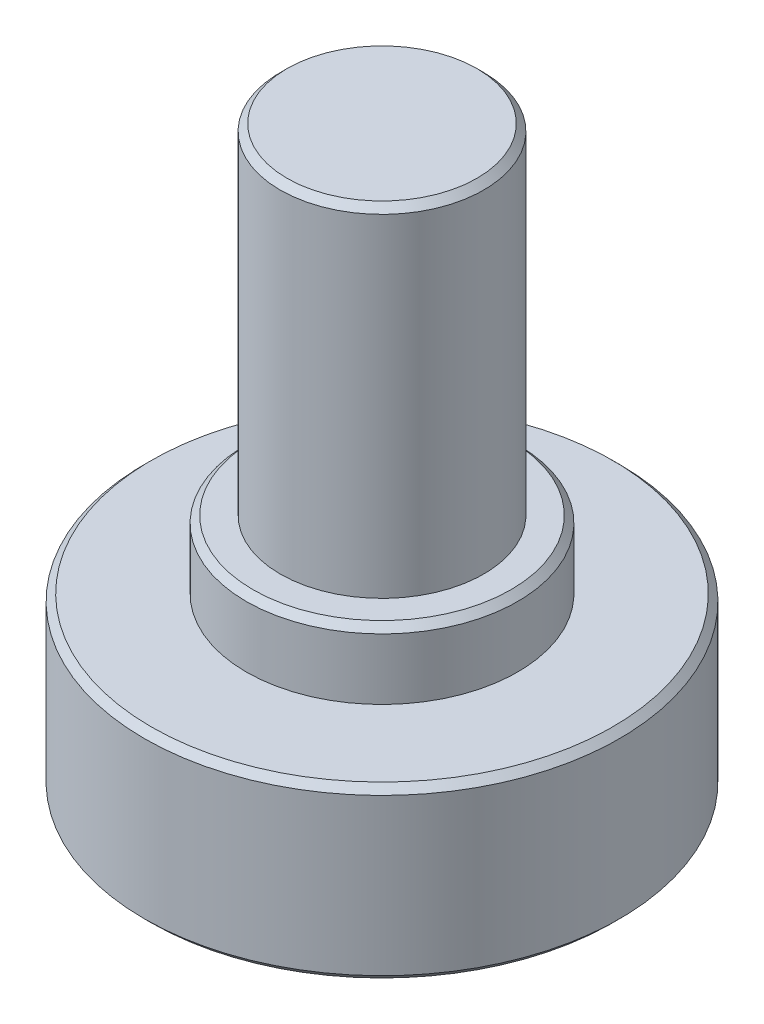
ISO-10303-21;
HEADER;
FILE_DESCRIPTION(('STEP AP214'),'2;1');
FILE_NAME('part.step','',(''),(''),'','','');
FILE_SCHEMA(('AUTOMOTIVE_DESIGN { 1 0 10303 214 1 1 1 1 }'));
ENDSEC;
DATA;
#1=APPLICATION_CONTEXT('core data for automotive mechanical design processes');
#2=APPLICATION_PROTOCOL_DEFINITION('international standard','automotive_design',2000,#1);
#3=PRODUCT_CONTEXT('',#1,'mechanical');
#4=PRODUCT('Part','Part','',(#3));
#5=PRODUCT_RELATED_PRODUCT_CATEGORY('part','',(#4));
#6=PRODUCT_DEFINITION_FORMATION('','',#4);
#7=PRODUCT_DEFINITION_CONTEXT('part definition',#1,'design');
#8=PRODUCT_DEFINITION('design','',#6,#7);
#9=PRODUCT_DEFINITION_SHAPE('','',#8);
#10=(LENGTH_UNIT() NAMED_UNIT(*) SI_UNIT(.MILLI.,.METRE.));
#11=(NAMED_UNIT(*) PLANE_ANGLE_UNIT() SI_UNIT($,.RADIAN.));
#12=(NAMED_UNIT(*) SI_UNIT($,.STERADIAN.) SOLID_ANGLE_UNIT());
#13=UNCERTAINTY_MEASURE_WITH_UNIT(LENGTH_MEASURE(1.E-05),#10,'distance_accuracy_value','');
#14=(GEOMETRIC_REPRESENTATION_CONTEXT(3) GLOBAL_UNCERTAINTY_ASSIGNED_CONTEXT((#13)) GLOBAL_UNIT_ASSIGNED_CONTEXT((#10,
#11,#12)) REPRESENTATION_CONTEXT('',''));
#15=CARTESIAN_POINT('',(0.,0.,0.));
#16=DIRECTION('',(0.,0.,1.));
#17=DIRECTION('',(1.,0.,0.));
#18=AXIS2_PLACEMENT_3D('',#15,#16,#17);
#19=CARTESIAN_POINT('',(0.,5.,0.));
#20=DIRECTION('',(0.,-1.,0.));
#21=DIRECTION('',(0.,0.,-1.));
#22=AXIS2_PLACEMENT_3D('',#19,#20,#21);
#23=CYLINDRICAL_SURFACE('',#22,7.);
#24=CARTESIAN_POINT('',(0.,0.200000000000001,0.));
#25=DIRECTION('',(0.,1.,0.));
#26=DIRECTION('',(0.,0.,1.));
#27=AXIS2_PLACEMENT_3D('',#24,#25,#26);
#28=CIRCLE('',#27,7.);
#29=CARTESIAN_POINT('',(0.,0.200000000000001,7.));
#30=VERTEX_POINT('',#29);
#31=EDGE_CURVE('E172',#30,#30,#28,.T.);
#32=ORIENTED_EDGE('',*,*,#31,.T.);
#33=EDGE_LOOP('',(#32));
#34=FACE_BOUND('',#33,.T.);
#35=CARTESIAN_POINT('',(0.,4.79999999999999,0.));
#36=DIRECTION('',(0.,1.,0.));
#37=DIRECTION('',(0.,0.,1.));
#38=AXIS2_PLACEMENT_3D('',#35,#36,#37);
#39=CIRCLE('',#38,7.);
#40=CARTESIAN_POINT('',(0.,4.79999999999999,7.));
#41=VERTEX_POINT('',#40);
#42=EDGE_CURVE('E169',#41,#41,#39,.F.);
#43=ORIENTED_EDGE('',*,*,#42,.T.);
#44=EDGE_LOOP('',(#43));
#45=FACE_BOUND('',#44,.T.);
#46=ADVANCED_FACE('F43',(#34,#45),#23,.T.);
#47=CARTESIAN_POINT('',(0.,5.,0.));
#48=DIRECTION('',(0.,1.,0.));
#49=DIRECTION('',(0.,0.,1.));
#50=AXIS2_PLACEMENT_3D('',#47,#48,#49);
#51=PLANE('',#50);
#52=CARTESIAN_POINT('',(0.,5.,0.));
#53=DIRECTION('',(0.,1.,0.));
#54=DIRECTION('',(0.,0.,1.));
#55=AXIS2_PLACEMENT_3D('',#52,#53,#54);
#56=CIRCLE('',#55,6.79999999999999);
#57=CARTESIAN_POINT('',(0.,5.,6.79999999999999));
#58=VERTEX_POINT('',#57);
#59=EDGE_CURVE('E11',#58,#58,#56,.T.);
#60=ORIENTED_EDGE('',*,*,#59,.T.);
#61=EDGE_LOOP('',(#60));
#62=FACE_BOUND('',#61,.T.);
#63=CARTESIAN_POINT('',(0.,5.,0.));
#64=DIRECTION('',(0.,1.,0.));
#65=DIRECTION('',(0.,0.,1.));
#66=AXIS2_PLACEMENT_3D('',#63,#64,#65);
#67=CIRCLE('',#66,4.);
#68=CARTESIAN_POINT('',(0.,5.,4.));
#69=VERTEX_POINT('',#68);
#70=EDGE_CURVE('E146',#69,#69,#67,.T.);
#71=ORIENTED_EDGE('',*,*,#70,.F.);
#72=EDGE_LOOP('',(#71));
#73=FACE_BOUND('',#72,.T.);
#74=ADVANCED_FACE('F187',(#62,#73),#51,.T.);
#75=CARTESIAN_POINT('',(0.,0.,0.));
#76=DIRECTION('',(0.,1.,0.));
#77=DIRECTION('',(0.,0.,1.));
#78=AXIS2_PLACEMENT_3D('',#75,#76,#77);
#79=PLANE('',#78);
#80=DIRECTION('',(-0.5,0.,0.866025403784438));
#81=VECTOR('',#80,1.);
#82=CARTESIAN_POINT('',(2.88675134594813,0.,0.));
#83=LINE('',#82,#81);
#84=CARTESIAN_POINT('',(2.88675134594813,0.,0.));
#85=VERTEX_POINT('',#84);
#86=CARTESIAN_POINT('',(1.44337567297406,0.,2.5));
#87=VERTEX_POINT('',#86);
#88=EDGE_CURVE('E133',#85,#87,#83,.T.);
#89=ORIENTED_EDGE('',*,*,#88,.F.);
#90=DIRECTION('',(0.5,0.,0.866025403784439));
#91=VECTOR('',#90,1.);
#92=CARTESIAN_POINT('',(1.44337567297407,0.,-2.5));
#93=LINE('',#92,#91);
#94=CARTESIAN_POINT('',(1.44337567297407,0.,-2.5));
#95=VERTEX_POINT('',#94);
#96=EDGE_CURVE('E59',#95,#85,#93,.T.);
#97=ORIENTED_EDGE('',*,*,#96,.F.);
#98=DIRECTION('',(1.,0.,0.));
#99=VECTOR('',#98,1.);
#100=CARTESIAN_POINT('',(-1.44337567297407,0.,-2.5));
#101=LINE('',#100,#99);
#102=CARTESIAN_POINT('',(-1.44337567297407,0.,-2.5));
#103=VERTEX_POINT('',#102);
#104=EDGE_CURVE('E142',#103,#95,#101,.T.);
#105=ORIENTED_EDGE('',*,*,#104,.F.);
#106=DIRECTION('',(0.5,0.,-0.866025403784439));
#107=VECTOR('',#106,1.);
#108=CARTESIAN_POINT('',(-2.88675134594813,0.,0.));
#109=LINE('',#108,#107);
#110=CARTESIAN_POINT('',(-2.88675134594813,0.,0.));
#111=VERTEX_POINT('',#110);
#112=EDGE_CURVE('E140',#111,#103,#109,.T.);
#113=ORIENTED_EDGE('',*,*,#112,.F.);
#114=DIRECTION('',(-0.5,0.,-0.866025403784439));
#115=VECTOR('',#114,1.);
#116=CARTESIAN_POINT('',(-1.44337567297407,0.,2.5));
#117=LINE('',#116,#115);
#118=CARTESIAN_POINT('',(-1.44337567297407,0.,2.5));
#119=VERTEX_POINT('',#118);
#120=EDGE_CURVE('E107',#119,#111,#117,.T.);
#121=ORIENTED_EDGE('',*,*,#120,.F.);
#122=DIRECTION('',(-1.,0.,0.));
#123=VECTOR('',#122,1.);
#124=CARTESIAN_POINT('',(1.44337567297406,0.,2.5));
#125=LINE('',#124,#123);
#126=EDGE_CURVE('E136',#87,#119,#125,.T.);
#127=ORIENTED_EDGE('',*,*,#126,.F.);
#128=EDGE_LOOP('',(#89,#97,#105,#113,#121,#127));
#129=FACE_BOUND('',#128,.T.);
#130=CARTESIAN_POINT('',(0.,0.,0.));
#131=DIRECTION('',(0.,1.,0.));
#132=DIRECTION('',(0.,0.,1.));
#133=AXIS2_PLACEMENT_3D('',#130,#131,#132);
#134=CIRCLE('',#133,6.8);
#135=CARTESIAN_POINT('',(0.,0.,6.8));
#136=VERTEX_POINT('',#135);
#137=EDGE_CURVE('E52',#136,#136,#134,.F.);
#138=ORIENTED_EDGE('',*,*,#137,.T.);
#139=EDGE_LOOP('',(#138));
#140=FACE_BOUND('',#139,.T.);
#141=ADVANCED_FACE('F177',(#129,#140),#79,.F.);
#142=CARTESIAN_POINT('',(0.,7.,0.));
#143=DIRECTION('',(0.,-1.,0.));
#144=DIRECTION('',(0.,0.,-1.));
#145=AXIS2_PLACEMENT_3D('',#142,#143,#144);
#146=CYLINDRICAL_SURFACE('',#145,4.);
#147=CARTESIAN_POINT('',(0.,6.8,0.));
#148=DIRECTION('',(0.,1.,0.));
#149=DIRECTION('',(0.,0.,1.));
#150=AXIS2_PLACEMENT_3D('',#147,#148,#149);
#151=CIRCLE('',#150,4.);
#152=CARTESIAN_POINT('',(0.,6.8,4.));
#153=VERTEX_POINT('',#152);
#154=EDGE_CURVE('E166',#153,#153,#151,.F.);
#155=ORIENTED_EDGE('',*,*,#154,.T.);
#156=EDGE_LOOP('',(#155));
#157=FACE_BOUND('',#156,.T.);
#158=ORIENTED_EDGE('',*,*,#70,.T.);
#159=EDGE_LOOP('',(#158));
#160=FACE_BOUND('',#159,.T.);
#161=ADVANCED_FACE('F201',(#157,#160),#146,.T.);
#162=CARTESIAN_POINT('',(0.,7.,0.));
#163=DIRECTION('',(0.,1.,0.));
#164=DIRECTION('',(0.,0.,1.));
#165=AXIS2_PLACEMENT_3D('',#162,#163,#164);
#166=PLANE('',#165);
#167=CARTESIAN_POINT('',(0.,7.,0.));
#168=DIRECTION('',(0.,1.,0.));
#169=DIRECTION('',(0.,0.,1.));
#170=AXIS2_PLACEMENT_3D('',#167,#168,#169);
#171=CIRCLE('',#170,3.8);
#172=CARTESIAN_POINT('',(0.,7.,3.8));
#173=VERTEX_POINT('',#172);
#174=EDGE_CURVE('E163',#173,#173,#171,.T.);
#175=ORIENTED_EDGE('',*,*,#174,.T.);
#176=EDGE_LOOP('',(#175));
#177=FACE_BOUND('',#176,.T.);
#178=CARTESIAN_POINT('',(0.,7.,0.));
#179=DIRECTION('',(0.,1.,0.));
#180=DIRECTION('',(0.,0.,1.));
#181=AXIS2_PLACEMENT_3D('',#178,#179,#180);
#182=CIRCLE('',#181,3.);
#183=CARTESIAN_POINT('',(0.,7.,3.));
#184=VERTEX_POINT('',#183);
#185=EDGE_CURVE('E152',#184,#184,#182,.T.);
#186=ORIENTED_EDGE('',*,*,#185,.F.);
#187=EDGE_LOOP('',(#186));
#188=FACE_BOUND('',#187,.T.);
#189=ADVANCED_FACE('F203',(#177,#188),#166,.T.);
#190=CARTESIAN_POINT('',(0.,17.,0.));
#191=DIRECTION('',(0.,-1.,0.));
#192=DIRECTION('',(0.,0.,-1.));
#193=AXIS2_PLACEMENT_3D('',#190,#191,#192);
#194=CYLINDRICAL_SURFACE('',#193,3.);
#195=CARTESIAN_POINT('',(0.,16.8,0.));
#196=DIRECTION('',(0.,1.,0.));
#197=DIRECTION('',(0.,0.,1.));
#198=AXIS2_PLACEMENT_3D('',#195,#196,#197);
#199=CIRCLE('',#198,3.);
#200=CARTESIAN_POINT('',(0.,16.8,3.));
#201=VERTEX_POINT('',#200);
#202=EDGE_CURVE('E160',#201,#201,#199,.F.);
#203=ORIENTED_EDGE('',*,*,#202,.T.);
#204=EDGE_LOOP('',(#203));
#205=FACE_BOUND('',#204,.T.);
#206=ORIENTED_EDGE('',*,*,#185,.T.);
#207=EDGE_LOOP('',(#206));
#208=FACE_BOUND('',#207,.T.);
#209=ADVANCED_FACE('F209',(#205,#208),#194,.T.);
#210=CARTESIAN_POINT('',(0.,17.,0.));
#211=DIRECTION('',(0.,1.,0.));
#212=DIRECTION('',(0.,0.,1.));
#213=AXIS2_PLACEMENT_3D('',#210,#211,#212);
#214=PLANE('',#213);
#215=CARTESIAN_POINT('',(0.,17.,0.));
#216=DIRECTION('',(0.,1.,0.));
#217=DIRECTION('',(0.,0.,1.));
#218=AXIS2_PLACEMENT_3D('',#215,#216,#217);
#219=CIRCLE('',#218,2.80000000000001);
#220=CARTESIAN_POINT('',(0.,17.,2.80000000000001));
#221=VERTEX_POINT('',#220);
#222=EDGE_CURVE('E155',#221,#221,#219,.T.);
#223=ORIENTED_EDGE('',*,*,#222,.T.);
#224=EDGE_LOOP('',(#223));
#225=FACE_BOUND('',#224,.T.);
#226=ADVANCED_FACE('F224',(#225),#214,.T.);
#227=CARTESIAN_POINT('',(0.,17.,0.));
#228=DIRECTION('',(0.,-1.,0.));
#229=DIRECTION('',(0.,0.,-1.));
#230=AXIS2_PLACEMENT_3D('',#227,#228,#229);
#231=CONICAL_SURFACE('',#230,2.80000000000001,0.785398163397444);
#232=ORIENTED_EDGE('',*,*,#202,.F.);
#233=EDGE_LOOP('',(#232));
#234=FACE_BOUND('',#233,.T.);
#235=ORIENTED_EDGE('',*,*,#222,.F.);
#236=EDGE_LOOP('',(#235));
#237=FACE_BOUND('',#236,.T.);
#238=ADVANCED_FACE('F218',(#234,#237),#231,.T.);
#239=CARTESIAN_POINT('',(0.,7.,0.));
#240=DIRECTION('',(0.,-1.,0.));
#241=DIRECTION('',(0.,0.,-1.));
#242=AXIS2_PLACEMENT_3D('',#239,#240,#241);
#243=CONICAL_SURFACE('',#242,3.8,0.785398163397448);
#244=ORIENTED_EDGE('',*,*,#154,.F.);
#245=EDGE_LOOP('',(#244));
#246=FACE_BOUND('',#245,.T.);
#247=ORIENTED_EDGE('',*,*,#174,.F.);
#248=EDGE_LOOP('',(#247));
#249=FACE_BOUND('',#248,.T.);
#250=ADVANCED_FACE('F182',(#246,#249),#243,.T.);
#251=CARTESIAN_POINT('',(0.,0.200000000000001,0.));
#252=DIRECTION('',(0.,1.,0.));
#253=DIRECTION('',(0.,0.,1.));
#254=AXIS2_PLACEMENT_3D('',#251,#252,#253);
#255=CONICAL_SURFACE('',#254,7.,0.785398163397453);
#256=ORIENTED_EDGE('',*,*,#137,.F.);
#257=EDGE_LOOP('',(#256));
#258=FACE_BOUND('',#257,.T.);
#259=ORIENTED_EDGE('',*,*,#31,.F.);
#260=EDGE_LOOP('',(#259));
#261=FACE_BOUND('',#260,.T.);
#262=ADVANCED_FACE('F179',(#258,#261),#255,.T.);
#263=CARTESIAN_POINT('',(0.,5.,0.));
#264=DIRECTION('',(0.,-1.,0.));
#265=DIRECTION('',(0.,0.,-1.));
#266=AXIS2_PLACEMENT_3D('',#263,#264,#265);
#267=CONICAL_SURFACE('',#266,6.79999999999999,0.785398163397442);
#268=ORIENTED_EDGE('',*,*,#42,.F.);
#269=EDGE_LOOP('',(#268));
#270=FACE_BOUND('',#269,.T.);
#271=ORIENTED_EDGE('',*,*,#59,.F.);
#272=EDGE_LOOP('',(#271));
#273=FACE_BOUND('',#272,.T.);
#274=ADVANCED_FACE('F46',(#270,#273),#267,.T.);
#275=CARTESIAN_POINT('',(1.44337567297407,2.5,-2.5));
#276=DIRECTION('',(0.866025403784439,0.,-0.5));
#277=DIRECTION('',(-0.5,0.,-0.866025403784439));
#278=AXIS2_PLACEMENT_3D('',#275,#276,#277);
#279=PLANE('',#278);
#280=ORIENTED_EDGE('',*,*,#96,.T.);
#281=DIRECTION('',(0.,-1.,0.));
#282=VECTOR('',#281,1.);
#283=CARTESIAN_POINT('',(2.88675134594813,2.5,0.));
#284=LINE('',#283,#282);
#285=CARTESIAN_POINT('',(2.88675134594813,2.5,0.));
#286=VERTEX_POINT('',#285);
#287=EDGE_CURVE('E89',#286,#85,#284,.T.);
#288=ORIENTED_EDGE('',*,*,#287,.F.);
#289=DIRECTION('',(0.5,0.,0.866025403784439));
#290=VECTOR('',#289,1.);
#291=CARTESIAN_POINT('',(1.44337567297407,2.5,-2.5));
#292=LINE('',#291,#290);
#293=CARTESIAN_POINT('',(1.44337567297407,2.5,-2.5));
#294=VERTEX_POINT('',#293);
#295=EDGE_CURVE('E144',#294,#286,#292,.T.);
#296=ORIENTED_EDGE('',*,*,#295,.F.);
#297=DIRECTION('',(0.,-1.,0.));
#298=VECTOR('',#297,1.);
#299=CARTESIAN_POINT('',(1.44337567297407,2.5,-2.5));
#300=LINE('',#299,#298);
#301=EDGE_CURVE('E67',#294,#95,#300,.T.);
#302=ORIENTED_EDGE('',*,*,#301,.T.);
#303=EDGE_LOOP('',(#280,#288,#296,#302));
#304=FACE_BOUND('',#303,.T.);
#305=ADVANCED_FACE('F193',(#304),#279,.F.);
#306=CARTESIAN_POINT('',(-1.44337567297407,2.5,-2.5));
#307=DIRECTION('',(0.,0.,-1.));
#308=DIRECTION('',(-1.,0.,0.));
#309=AXIS2_PLACEMENT_3D('',#306,#307,#308);
#310=PLANE('',#309);
#311=ORIENTED_EDGE('',*,*,#104,.T.);
#312=ORIENTED_EDGE('',*,*,#301,.F.);
#313=DIRECTION('',(1.,0.,0.));
#314=VECTOR('',#313,1.);
#315=CARTESIAN_POINT('',(-1.44337567297407,2.5,-2.5));
#316=LINE('',#315,#314);
#317=CARTESIAN_POINT('',(-1.44337567297407,2.5,-2.5));
#318=VERTEX_POINT('',#317);
#319=EDGE_CURVE('E119',#318,#294,#316,.T.);
#320=ORIENTED_EDGE('',*,*,#319,.F.);
#321=DIRECTION('',(0.,-1.,0.));
#322=VECTOR('',#321,1.);
#323=CARTESIAN_POINT('',(-1.44337567297407,2.5,-2.5));
#324=LINE('',#323,#322);
#325=EDGE_CURVE('E111',#318,#103,#324,.T.);
#326=ORIENTED_EDGE('',*,*,#325,.T.);
#327=EDGE_LOOP('',(#311,#312,#320,#326));
#328=FACE_BOUND('',#327,.T.);
#329=ADVANCED_FACE('F253',(#328),#310,.F.);
#330=CARTESIAN_POINT('',(-2.88675134594813,2.5,0.));
#331=DIRECTION('',(-0.866025403784438,0.,-0.5));
#332=DIRECTION('',(-0.5,0.,0.866025403784439));
#333=AXIS2_PLACEMENT_3D('',#330,#331,#332);
#334=PLANE('',#333);
#335=ORIENTED_EDGE('',*,*,#112,.T.);
#336=ORIENTED_EDGE('',*,*,#325,.F.);
#337=DIRECTION('',(0.5,0.,-0.866025403784439));
#338=VECTOR('',#337,1.);
#339=CARTESIAN_POINT('',(-2.88675134594813,2.5,0.));
#340=LINE('',#339,#338);
#341=CARTESIAN_POINT('',(-2.88675134594813,2.5,0.));
#342=VERTEX_POINT('',#341);
#343=EDGE_CURVE('E115',#342,#318,#340,.T.);
#344=ORIENTED_EDGE('',*,*,#343,.F.);
#345=DIRECTION('',(0.,-1.,0.));
#346=VECTOR('',#345,1.);
#347=CARTESIAN_POINT('',(-2.88675134594813,2.5,0.));
#348=LINE('',#347,#346);
#349=EDGE_CURVE('E100',#342,#111,#348,.T.);
#350=ORIENTED_EDGE('',*,*,#349,.T.);
#351=EDGE_LOOP('',(#335,#336,#344,#350));
#352=FACE_BOUND('',#351,.T.);
#353=ADVANCED_FACE('F116',(#352),#334,.F.);
#354=CARTESIAN_POINT('',(-1.44337567297407,2.5,2.5));
#355=DIRECTION('',(-0.866025403784439,0.,0.5));
#356=DIRECTION('',(0.5,0.,0.866025403784439));
#357=AXIS2_PLACEMENT_3D('',#354,#355,#356);
#358=PLANE('',#357);
#359=ORIENTED_EDGE('',*,*,#120,.T.);
#360=ORIENTED_EDGE('',*,*,#349,.F.);
#361=DIRECTION('',(-0.5,0.,-0.866025403784439));
#362=VECTOR('',#361,1.);
#363=CARTESIAN_POINT('',(-1.44337567297407,2.5,2.5));
#364=LINE('',#363,#362);
#365=CARTESIAN_POINT('',(-1.44337567297407,2.5,2.5));
#366=VERTEX_POINT('',#365);
#367=EDGE_CURVE('E104',#366,#342,#364,.T.);
#368=ORIENTED_EDGE('',*,*,#367,.F.);
#369=DIRECTION('',(0.,-1.,0.));
#370=VECTOR('',#369,1.);
#371=CARTESIAN_POINT('',(-1.44337567297407,2.5,2.5));
#372=LINE('',#371,#370);
#373=EDGE_CURVE('E112',#366,#119,#372,.T.);
#374=ORIENTED_EDGE('',*,*,#373,.T.);
#375=EDGE_LOOP('',(#359,#360,#368,#374));
#376=FACE_BOUND('',#375,.T.);
#377=ADVANCED_FACE('F102',(#376),#358,.F.);
#378=CARTESIAN_POINT('',(1.44337567297406,2.5,2.5));
#379=DIRECTION('',(0.,0.,1.));
#380=DIRECTION('',(1.,0.,0.));
#381=AXIS2_PLACEMENT_3D('',#378,#379,#380);
#382=PLANE('',#381);
#383=ORIENTED_EDGE('',*,*,#126,.T.);
#384=ORIENTED_EDGE('',*,*,#373,.F.);
#385=DIRECTION('',(-1.,0.,0.));
#386=VECTOR('',#385,1.);
#387=CARTESIAN_POINT('',(1.44337567297406,2.5,2.5));
#388=LINE('',#387,#386);
#389=CARTESIAN_POINT('',(1.44337567297406,2.5,2.5));
#390=VERTEX_POINT('',#389);
#391=EDGE_CURVE('E125',#390,#366,#388,.T.);
#392=ORIENTED_EDGE('',*,*,#391,.F.);
#393=DIRECTION('',(0.,-1.,0.));
#394=VECTOR('',#393,1.);
#395=CARTESIAN_POINT('',(1.44337567297406,2.5,2.5));
#396=LINE('',#395,#394);
#397=EDGE_CURVE('E149',#390,#87,#396,.T.);
#398=ORIENTED_EDGE('',*,*,#397,.T.);
#399=EDGE_LOOP('',(#383,#384,#392,#398));
#400=FACE_BOUND('',#399,.T.);
#401=ADVANCED_FACE('F257',(#400),#382,.F.);
#402=CARTESIAN_POINT('',(2.88675134594813,2.5,0.));
#403=DIRECTION('',(0.866025403784439,0.,0.5));
#404=DIRECTION('',(0.5,0.,-0.866025403784439));
#405=AXIS2_PLACEMENT_3D('',#402,#403,#404);
#406=PLANE('',#405);
#407=ORIENTED_EDGE('',*,*,#88,.T.);
#408=ORIENTED_EDGE('',*,*,#397,.F.);
#409=DIRECTION('',(-0.5,0.,0.866025403784438));
#410=VECTOR('',#409,1.);
#411=CARTESIAN_POINT('',(2.88675134594813,2.5,0.));
#412=LINE('',#411,#410);
#413=EDGE_CURVE('E127',#286,#390,#412,.T.);
#414=ORIENTED_EDGE('',*,*,#413,.F.);
#415=ORIENTED_EDGE('',*,*,#287,.T.);
#416=EDGE_LOOP('',(#407,#408,#414,#415));
#417=FACE_BOUND('',#416,.T.);
#418=ADVANCED_FACE('F254',(#417),#406,.F.);
#419=CARTESIAN_POINT('',(0.,2.5,0.));
#420=DIRECTION('',(0.,-1.,0.));
#421=DIRECTION('',(0.,0.,-1.));
#422=AXIS2_PLACEMENT_3D('',#419,#420,#421);
#423=PLANE('',#422);
#424=ORIENTED_EDGE('',*,*,#295,.T.);
#425=ORIENTED_EDGE('',*,*,#413,.T.);
#426=ORIENTED_EDGE('',*,*,#391,.T.);
#427=ORIENTED_EDGE('',*,*,#367,.T.);
#428=ORIENTED_EDGE('',*,*,#343,.T.);
#429=ORIENTED_EDGE('',*,*,#319,.T.);
#430=EDGE_LOOP('',(#424,#425,#426,#427,#428,#429));
#431=FACE_BOUND('',#430,.T.);
#432=ADVANCED_FACE('F122',(#431),#423,.T.);
#433=CLOSED_SHELL('',(#46,#74,#141,#161,#189,#209,#226,#238,#250,#262,#274,#305,#329,#353,#377,
#401,#418,#432));
#434=MANIFOLD_SOLID_BREP('B2',#433);
#435=ADVANCED_BREP_SHAPE_REPRESENTATION('',(#18,#434),#14);
#436=SHAPE_DEFINITION_REPRESENTATION(#9,#435);
ENDSEC;
END-ISO-10303-21;
